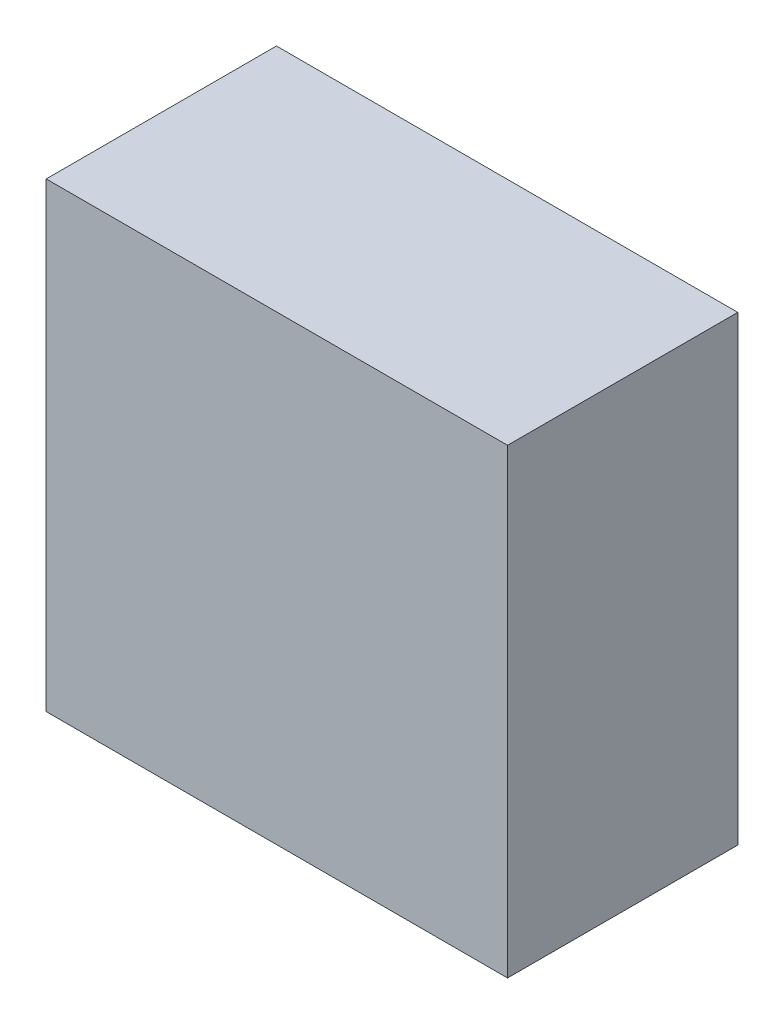
ISO-10303-21;
HEADER;
FILE_DESCRIPTION(('STEP AP214'),'2;1');
FILE_NAME('part.step','',(''),(''),'','','');
FILE_SCHEMA(('AUTOMOTIVE_DESIGN { 1 0 10303 214 1 1 1 1 }'));
ENDSEC;
DATA;
#1=APPLICATION_CONTEXT('core data for automotive mechanical design processes');
#2=APPLICATION_PROTOCOL_DEFINITION('international standard','automotive_design',2000,#1);
#3=PRODUCT_CONTEXT('',#1,'mechanical');
#4=PRODUCT('Part','Part','',(#3));
#5=PRODUCT_RELATED_PRODUCT_CATEGORY('part','',(#4));
#6=PRODUCT_DEFINITION_FORMATION('','',#4);
#7=PRODUCT_DEFINITION_CONTEXT('part definition',#1,'design');
#8=PRODUCT_DEFINITION('design','',#6,#7);
#9=PRODUCT_DEFINITION_SHAPE('','',#8);
#10=(LENGTH_UNIT() NAMED_UNIT(*) SI_UNIT(.MILLI.,.METRE.));
#11=(NAMED_UNIT(*) PLANE_ANGLE_UNIT() SI_UNIT($,.RADIAN.));
#12=(NAMED_UNIT(*) SI_UNIT($,.STERADIAN.) SOLID_ANGLE_UNIT());
#13=UNCERTAINTY_MEASURE_WITH_UNIT(LENGTH_MEASURE(1.E-05),#10,'distance_accuracy_value','');
#14=(GEOMETRIC_REPRESENTATION_CONTEXT(3) GLOBAL_UNCERTAINTY_ASSIGNED_CONTEXT((#13)) GLOBAL_UNIT_ASSIGNED_CONTEXT((#10,
#11,#12)) REPRESENTATION_CONTEXT('',''));
#15=CARTESIAN_POINT('',(0.,0.,0.));
#16=DIRECTION('',(0.,0.,1.));
#17=DIRECTION('',(1.,0.,0.));
#18=AXIS2_PLACEMENT_3D('',#15,#16,#17);
#19=CARTESIAN_POINT('',(-50.1,50.1,-50.));
#20=DIRECTION('',(-1.,0.,0.));
#21=DIRECTION('',(0.,0.,1.));
#22=AXIS2_PLACEMENT_3D('',#19,#20,#21);
#23=PLANE('',#22);
#24=DIRECTION('',(0.,-1.,0.));
#25=VECTOR('',#24,1.);
#26=CARTESIAN_POINT('',(-50.1,50.1,0.));
#27=LINE('',#26,#25);
#28=CARTESIAN_POINT('',(-50.1,50.1,0.));
#29=VERTEX_POINT('',#28);
#30=CARTESIAN_POINT('',(-50.1,-50.1,0.));
#31=VERTEX_POINT('',#30);
#32=EDGE_CURVE('E97',#29,#31,#27,.T.);
#33=ORIENTED_EDGE('',*,*,#32,.F.);
#34=DIRECTION('',(0.,0.,1.));
#35=VECTOR('',#34,1.);
#36=CARTESIAN_POINT('',(-50.1,50.1,-50.));
#37=LINE('',#36,#35);
#38=CARTESIAN_POINT('',(-50.1,50.1,-50.));
#39=VERTEX_POINT('',#38);
#40=EDGE_CURVE('E11',#39,#29,#37,.T.);
#41=ORIENTED_EDGE('',*,*,#40,.F.);
#42=DIRECTION('',(0.,-1.,0.));
#43=VECTOR('',#42,1.);
#44=CARTESIAN_POINT('',(-50.1,50.1,-50.));
#45=LINE('',#44,#43);
#46=CARTESIAN_POINT('',(-50.1,-50.1,-50.));
#47=VERTEX_POINT('',#46);
#48=EDGE_CURVE('E91',#39,#47,#45,.T.);
#49=ORIENTED_EDGE('',*,*,#48,.T.);
#50=DIRECTION('',(0.,0.,1.));
#51=VECTOR('',#50,1.);
#52=CARTESIAN_POINT('',(-50.1,-50.1,-50.));
#53=LINE('',#52,#51);
#54=EDGE_CURVE('E36',#47,#31,#53,.T.);
#55=ORIENTED_EDGE('',*,*,#54,.T.);
#56=EDGE_LOOP('',(#33,#41,#49,#55));
#57=FACE_BOUND('',#56,.T.);
#58=ADVANCED_FACE('F33',(#57),#23,.T.);
#59=CARTESIAN_POINT('',(50.1,50.1,-50.));
#60=DIRECTION('',(0.,1.,0.));
#61=DIRECTION('',(0.,0.,1.));
#62=AXIS2_PLACEMENT_3D('',#59,#60,#61);
#63=PLANE('',#62);
#64=DIRECTION('',(-1.,0.,0.));
#65=VECTOR('',#64,1.);
#66=CARTESIAN_POINT('',(50.1,50.1,0.));
#67=LINE('',#66,#65);
#68=CARTESIAN_POINT('',(50.1,50.1,0.));
#69=VERTEX_POINT('',#68);
#70=EDGE_CURVE('E93',#69,#29,#67,.T.);
#71=ORIENTED_EDGE('',*,*,#70,.F.);
#72=DIRECTION('',(0.,0.,1.));
#73=VECTOR('',#72,1.);
#74=CARTESIAN_POINT('',(50.1,50.1,-50.));
#75=LINE('',#74,#73);
#76=CARTESIAN_POINT('',(50.1,50.1,-50.));
#77=VERTEX_POINT('',#76);
#78=EDGE_CURVE('E42',#77,#69,#75,.T.);
#79=ORIENTED_EDGE('',*,*,#78,.F.);
#80=DIRECTION('',(-1.,0.,0.));
#81=VECTOR('',#80,1.);
#82=CARTESIAN_POINT('',(50.1,50.1,-50.));
#83=LINE('',#82,#81);
#84=EDGE_CURVE('E88',#77,#39,#83,.T.);
#85=ORIENTED_EDGE('',*,*,#84,.T.);
#86=ORIENTED_EDGE('',*,*,#40,.T.);
#87=EDGE_LOOP('',(#71,#79,#85,#86));
#88=FACE_BOUND('',#87,.T.);
#89=ADVANCED_FACE('F107',(#88),#63,.T.);
#90=CARTESIAN_POINT('',(50.1,50.1,-50.));
#91=DIRECTION('',(1.,0.,0.));
#92=DIRECTION('',(0.,0.,-1.));
#93=AXIS2_PLACEMENT_3D('',#90,#91,#92);
#94=PLANE('',#93);
#95=DIRECTION('',(0.,1.,0.));
#96=VECTOR('',#95,1.);
#97=CARTESIAN_POINT('',(50.1,50.1,0.));
#98=LINE('',#97,#96);
#99=CARTESIAN_POINT('',(50.1,-50.1,0.));
#100=VERTEX_POINT('',#99);
#101=EDGE_CURVE('E83',#100,#69,#98,.T.);
#102=ORIENTED_EDGE('',*,*,#101,.F.);
#103=DIRECTION('',(0.,0.,1.));
#104=VECTOR('',#103,1.);
#105=CARTESIAN_POINT('',(50.1,-50.1,-50.));
#106=LINE('',#105,#104);
#107=CARTESIAN_POINT('',(50.1,-50.1,-50.));
#108=VERTEX_POINT('',#107);
#109=EDGE_CURVE('E78',#108,#100,#106,.T.);
#110=ORIENTED_EDGE('',*,*,#109,.F.);
#111=DIRECTION('',(0.,1.,0.));
#112=VECTOR('',#111,1.);
#113=CARTESIAN_POINT('',(50.1,50.1,-50.));
#114=LINE('',#113,#112);
#115=EDGE_CURVE('E81',#108,#77,#114,.T.);
#116=ORIENTED_EDGE('',*,*,#115,.T.);
#117=ORIENTED_EDGE('',*,*,#78,.T.);
#118=EDGE_LOOP('',(#102,#110,#116,#117));
#119=FACE_BOUND('',#118,.T.);
#120=ADVANCED_FACE('F80',(#119),#94,.T.);
#121=CARTESIAN_POINT('',(50.1,-50.1,-50.));
#122=DIRECTION('',(0.,-1.,0.));
#123=DIRECTION('',(0.,0.,-1.));
#124=AXIS2_PLACEMENT_3D('',#121,#122,#123);
#125=PLANE('',#124);
#126=DIRECTION('',(1.,0.,0.));
#127=VECTOR('',#126,1.);
#128=CARTESIAN_POINT('',(50.1,-50.1,0.));
#129=LINE('',#128,#127);
#130=EDGE_CURVE('E100',#31,#100,#129,.T.);
#131=ORIENTED_EDGE('',*,*,#130,.F.);
#132=ORIENTED_EDGE('',*,*,#54,.F.);
#133=DIRECTION('',(1.,0.,0.));
#134=VECTOR('',#133,1.);
#135=CARTESIAN_POINT('',(50.1,-50.1,-50.));
#136=LINE('',#135,#134);
#137=EDGE_CURVE('E87',#47,#108,#136,.T.);
#138=ORIENTED_EDGE('',*,*,#137,.T.);
#139=ORIENTED_EDGE('',*,*,#109,.T.);
#140=EDGE_LOOP('',(#131,#132,#138,#139));
#141=FACE_BOUND('',#140,.T.);
#142=ADVANCED_FACE('F90',(#141),#125,.T.);
#143=CARTESIAN_POINT('',(0.,0.,-50.));
#144=DIRECTION('',(0.,0.,-1.));
#145=DIRECTION('',(-1.,0.,0.));
#146=AXIS2_PLACEMENT_3D('',#143,#144,#145);
#147=PLANE('',#146);
#148=ORIENTED_EDGE('',*,*,#48,.F.);
#149=ORIENTED_EDGE('',*,*,#84,.F.);
#150=ORIENTED_EDGE('',*,*,#115,.F.);
#151=ORIENTED_EDGE('',*,*,#137,.F.);
#152=EDGE_LOOP('',(#148,#149,#150,#151));
#153=FACE_BOUND('',#152,.T.);
#154=ADVANCED_FACE('F86',(#153),#147,.T.);
#155=CARTESIAN_POINT('',(0.,0.,0.));
#156=DIRECTION('',(0.,0.,-1.));
#157=DIRECTION('',(-1.,0.,0.));
#158=AXIS2_PLACEMENT_3D('',#155,#156,#157);
#159=PLANE('',#158);
#160=ORIENTED_EDGE('',*,*,#32,.T.);
#161=ORIENTED_EDGE('',*,*,#130,.T.);
#162=ORIENTED_EDGE('',*,*,#101,.T.);
#163=ORIENTED_EDGE('',*,*,#70,.T.);
#164=EDGE_LOOP('',(#160,#161,#162,#163));
#165=FACE_BOUND('',#164,.T.);
#166=ADVANCED_FACE('F106',(#165),#159,.F.);
#167=CLOSED_SHELL('',(#58,#89,#120,#142,#154,#166));
#168=MANIFOLD_SOLID_BREP('B2',#167);
#169=ADVANCED_BREP_SHAPE_REPRESENTATION('',(#18,#168),#14);
#170=SHAPE_DEFINITION_REPRESENTATION(#9,#169);
ENDSEC;
END-ISO-10303-21;
